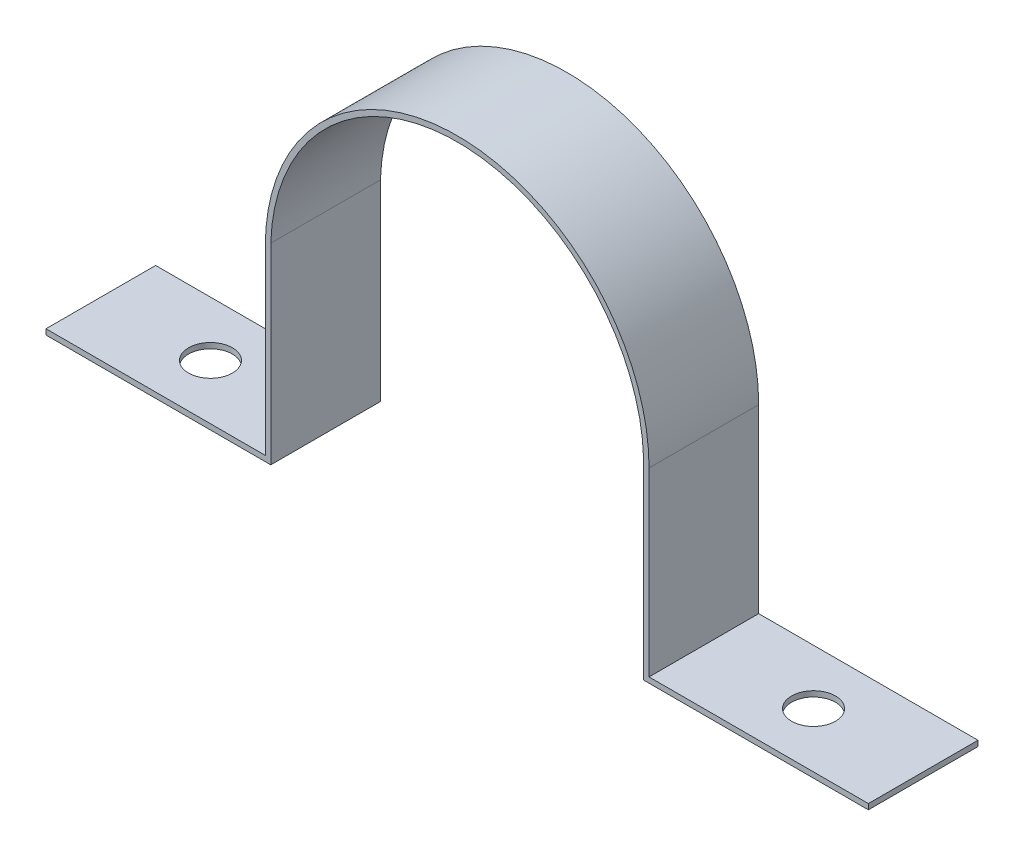
ISO-10303-21;
HEADER;
FILE_DESCRIPTION(('STEP AP214'),'2;1');
FILE_NAME('part.step','',(''),(''),'','','');
FILE_SCHEMA(('AUTOMOTIVE_DESIGN { 1 0 10303 214 1 1 1 1 }'));
ENDSEC;
DATA;
#1=APPLICATION_CONTEXT('core data for automotive mechanical design processes');
#2=APPLICATION_PROTOCOL_DEFINITION('international standard','automotive_design',2000,#1);
#3=PRODUCT_CONTEXT('',#1,'mechanical');
#4=PRODUCT('Part','Part','',(#3));
#5=PRODUCT_RELATED_PRODUCT_CATEGORY('part','',(#4));
#6=PRODUCT_DEFINITION_FORMATION('','',#4);
#7=PRODUCT_DEFINITION_CONTEXT('part definition',#1,'design');
#8=PRODUCT_DEFINITION('design','',#6,#7);
#9=PRODUCT_DEFINITION_SHAPE('','',#8);
#10=(LENGTH_UNIT() NAMED_UNIT(*) SI_UNIT(.MILLI.,.METRE.));
#11=(NAMED_UNIT(*) PLANE_ANGLE_UNIT() SI_UNIT($,.RADIAN.));
#12=(NAMED_UNIT(*) SI_UNIT($,.STERADIAN.) SOLID_ANGLE_UNIT());
#13=UNCERTAINTY_MEASURE_WITH_UNIT(LENGTH_MEASURE(1.E-05),#10,'distance_accuracy_value','');
#14=(GEOMETRIC_REPRESENTATION_CONTEXT(3) GLOBAL_UNCERTAINTY_ASSIGNED_CONTEXT((#13)) GLOBAL_UNIT_ASSIGNED_CONTEXT((#10,
#11,#12)) REPRESENTATION_CONTEXT('',''));
#15=CARTESIAN_POINT('',(0.,0.,0.));
#16=DIRECTION('',(0.,0.,1.));
#17=DIRECTION('',(1.,0.,0.));
#18=AXIS2_PLACEMENT_3D('',#15,#16,#17);
#19=CARTESIAN_POINT('',(0.,0.,10.));
#20=DIRECTION('',(0.,0.,-1.));
#21=DIRECTION('',(-1.,0.,0.));
#22=AXIS2_PLACEMENT_3D('',#19,#20,#21);
#23=CYLINDRICAL_SURFACE('',#22,17.5);
#24=CARTESIAN_POINT('',(0.,0.,0.));
#25=DIRECTION('',(0.,0.,1.));
#26=DIRECTION('',(1.,0.,0.));
#27=AXIS2_PLACEMENT_3D('',#24,#25,#26);
#28=CIRCLE('',#27,17.5);
#29=CARTESIAN_POINT('',(17.5,0.,0.));
#30=VERTEX_POINT('',#29);
#31=CARTESIAN_POINT('',(-17.5,0.,0.));
#32=VERTEX_POINT('',#31);
#33=EDGE_CURVE('E169',#30,#32,#28,.T.);
#34=ORIENTED_EDGE('',*,*,#33,.T.);
#35=DIRECTION('',(0.,0.,-1.));
#36=VECTOR('',#35,1.);
#37=CARTESIAN_POINT('',(-17.5,0.,10.));
#38=LINE('',#37,#36);
#39=CARTESIAN_POINT('',(-17.5,0.,10.));
#40=VERTEX_POINT('',#39);
#41=EDGE_CURVE('E13',#40,#32,#38,.T.);
#42=ORIENTED_EDGE('',*,*,#41,.F.);
#43=CARTESIAN_POINT('',(0.,0.,10.));
#44=DIRECTION('',(0.,0.,1.));
#45=DIRECTION('',(1.,0.,0.));
#46=AXIS2_PLACEMENT_3D('',#43,#44,#45);
#47=CIRCLE('',#46,17.5);
#48=CARTESIAN_POINT('',(17.5,0.,10.));
#49=VERTEX_POINT('',#48);
#50=EDGE_CURVE('E191',#49,#40,#47,.T.);
#51=ORIENTED_EDGE('',*,*,#50,.F.);
#52=DIRECTION('',(0.,0.,-1.));
#53=VECTOR('',#52,1.);
#54=CARTESIAN_POINT('',(17.5,0.,10.));
#55=LINE('',#54,#53);
#56=EDGE_CURVE('E165',#49,#30,#55,.T.);
#57=ORIENTED_EDGE('',*,*,#56,.T.);
#58=EDGE_LOOP('',(#34,#42,#51,#57));
#59=FACE_BOUND('',#58,.T.);
#60=ADVANCED_FACE('F48',(#59),#23,.T.);
#61=CARTESIAN_POINT('',(-17.5,0.,10.));
#62=DIRECTION('',(1.,0.,0.));
#63=DIRECTION('',(0.,0.,-1.));
#64=AXIS2_PLACEMENT_3D('',#61,#62,#63);
#65=PLANE('',#64);
#66=DIRECTION('',(0.,-1.,0.));
#67=VECTOR('',#66,1.);
#68=CARTESIAN_POINT('',(-17.5,0.,0.));
#69=LINE('',#68,#67);
#70=CARTESIAN_POINT('',(-17.5,-16.5073513516949,0.));
#71=VERTEX_POINT('',#70);
#72=EDGE_CURVE('E172',#32,#71,#69,.T.);
#73=ORIENTED_EDGE('',*,*,#72,.T.);
#74=DIRECTION('',(0.,0.,-1.));
#75=VECTOR('',#74,1.);
#76=CARTESIAN_POINT('',(-17.5,-16.5073513516949,10.));
#77=LINE('',#76,#75);
#78=CARTESIAN_POINT('',(-17.5,-16.5073513516949,10.));
#79=VERTEX_POINT('',#78);
#80=EDGE_CURVE('E57',#79,#71,#77,.T.);
#81=ORIENTED_EDGE('',*,*,#80,.F.);
#82=DIRECTION('',(0.,-1.,0.));
#83=VECTOR('',#82,1.);
#84=CARTESIAN_POINT('',(-17.5,0.,10.));
#85=LINE('',#84,#83);
#86=EDGE_CURVE('E120',#40,#79,#85,.T.);
#87=ORIENTED_EDGE('',*,*,#86,.F.);
#88=ORIENTED_EDGE('',*,*,#41,.T.);
#89=EDGE_LOOP('',(#73,#81,#87,#88));
#90=FACE_BOUND('',#89,.T.);
#91=ADVANCED_FACE('F271',(#90),#65,.F.);
#92=CARTESIAN_POINT('',(-37.5,-16.5073513516949,10.));
#93=DIRECTION('',(0.,-1.,0.));
#94=DIRECTION('',(0.,0.,-1.));
#95=AXIS2_PLACEMENT_3D('',#92,#93,#94);
#96=PLANE('',#95);
#97=CARTESIAN_POINT('',(-27.5,-16.5073513516949,5.));
#98=DIRECTION('',(0.,1.,0.));
#99=DIRECTION('',(0.,0.,1.));
#100=AXIS2_PLACEMENT_3D('',#97,#98,#99);
#101=CIRCLE('',#100,2.);
#102=CARTESIAN_POINT('',(-27.5,-16.5073513516949,7.));
#103=VERTEX_POINT('',#102);
#104=EDGE_CURVE('E340',#103,#103,#101,.T.);
#105=ORIENTED_EDGE('',*,*,#104,.F.);
#106=EDGE_LOOP('',(#105));
#107=FACE_BOUND('',#106,.T.);
#108=DIRECTION('',(-1.,0.,0.));
#109=VECTOR('',#108,1.);
#110=CARTESIAN_POINT('',(-37.5,-16.5073513516949,0.));
#111=LINE('',#110,#109);
#112=CARTESIAN_POINT('',(-37.5,-16.5073513516949,0.));
#113=VERTEX_POINT('',#112);
#114=EDGE_CURVE('E174',#71,#113,#111,.T.);
#115=ORIENTED_EDGE('',*,*,#114,.T.);
#116=DIRECTION('',(0.,0.,-1.));
#117=VECTOR('',#116,1.);
#118=CARTESIAN_POINT('',(-37.5,-16.5073513516949,10.));
#119=LINE('',#118,#117);
#120=CARTESIAN_POINT('',(-37.5,-16.5073513516949,10.));
#121=VERTEX_POINT('',#120);
#122=EDGE_CURVE('E210',#121,#113,#119,.T.);
#123=ORIENTED_EDGE('',*,*,#122,.F.);
#124=DIRECTION('',(-1.,0.,0.));
#125=VECTOR('',#124,1.);
#126=CARTESIAN_POINT('',(-37.5,-16.5073513516949,10.));
#127=LINE('',#126,#125);
#128=EDGE_CURVE('E219',#79,#121,#127,.T.);
#129=ORIENTED_EDGE('',*,*,#128,.F.);
#130=ORIENTED_EDGE('',*,*,#80,.T.);
#131=EDGE_LOOP('',(#115,#123,#129,#130));
#132=FACE_BOUND('',#131,.T.);
#133=ADVANCED_FACE('F217',(#107,#132),#96,.F.);
#134=CARTESIAN_POINT('',(-37.5,-17.007351351695,10.));
#135=DIRECTION('',(1.,0.,0.));
#136=DIRECTION('',(0.,0.,-1.));
#137=AXIS2_PLACEMENT_3D('',#134,#135,#136);
#138=PLANE('',#137);
#139=DIRECTION('',(0.,-1.,0.));
#140=VECTOR('',#139,1.);
#141=CARTESIAN_POINT('',(-37.5,-17.007351351695,0.));
#142=LINE('',#141,#140);
#143=CARTESIAN_POINT('',(-37.5,-17.007351351695,0.));
#144=VERTEX_POINT('',#143);
#145=EDGE_CURVE('E176',#113,#144,#142,.T.);
#146=ORIENTED_EDGE('',*,*,#145,.T.);
#147=DIRECTION('',(0.,0.,-1.));
#148=VECTOR('',#147,1.);
#149=CARTESIAN_POINT('',(-37.5,-17.007351351695,10.));
#150=LINE('',#149,#148);
#151=CARTESIAN_POINT('',(-37.5,-17.007351351695,10.));
#152=VERTEX_POINT('',#151);
#153=EDGE_CURVE('E207',#152,#144,#150,.T.);
#154=ORIENTED_EDGE('',*,*,#153,.F.);
#155=DIRECTION('',(0.,-1.,0.));
#156=VECTOR('',#155,1.);
#157=CARTESIAN_POINT('',(-37.5,-17.007351351695,10.));
#158=LINE('',#157,#156);
#159=EDGE_CURVE('E237',#121,#152,#158,.T.);
#160=ORIENTED_EDGE('',*,*,#159,.F.);
#161=ORIENTED_EDGE('',*,*,#122,.T.);
#162=EDGE_LOOP('',(#146,#154,#160,#161));
#163=FACE_BOUND('',#162,.T.);
#164=ADVANCED_FACE('F228',(#163),#138,.F.);
#165=CARTESIAN_POINT('',(-17.,-17.0073513516949,10.));
#166=DIRECTION('',(0.,1.,0.));
#167=DIRECTION('',(-1.,0.,0.));
#168=AXIS2_PLACEMENT_3D('',#165,#166,#167);
#169=PLANE('',#168);
#170=CARTESIAN_POINT('',(-27.5,-17.0073513516949,5.));
#171=DIRECTION('',(0.,1.,0.));
#172=DIRECTION('',(-1.,0.,0.));
#173=AXIS2_PLACEMENT_3D('',#170,#171,#172);
#174=CIRCLE('',#173,2.);
#175=CARTESIAN_POINT('',(-29.5,-17.0073513516949,5.));
#176=VERTEX_POINT('',#175);
#177=EDGE_CURVE('E51',#176,#176,#174,.T.);
#178=ORIENTED_EDGE('',*,*,#177,.T.);
#179=EDGE_LOOP('',(#178));
#180=FACE_BOUND('',#179,.T.);
#181=DIRECTION('',(1.,0.,0.));
#182=VECTOR('',#181,1.);
#183=CARTESIAN_POINT('',(-17.,-17.0073513516949,0.));
#184=LINE('',#183,#182);
#185=CARTESIAN_POINT('',(-17.,-17.0073513516949,0.));
#186=VERTEX_POINT('',#185);
#187=EDGE_CURVE('E178',#144,#186,#184,.T.);
#188=ORIENTED_EDGE('',*,*,#187,.T.);
#189=DIRECTION('',(0.,0.,-1.));
#190=VECTOR('',#189,1.);
#191=CARTESIAN_POINT('',(-17.,-17.0073513516949,10.));
#192=LINE('',#191,#190);
#193=CARTESIAN_POINT('',(-17.,-17.0073513516949,10.));
#194=VERTEX_POINT('',#193);
#195=EDGE_CURVE('E204',#194,#186,#192,.T.);
#196=ORIENTED_EDGE('',*,*,#195,.F.);
#197=DIRECTION('',(1.,0.,0.));
#198=VECTOR('',#197,1.);
#199=CARTESIAN_POINT('',(-17.,-17.0073513516949,10.));
#200=LINE('',#199,#198);
#201=EDGE_CURVE('E234',#152,#194,#200,.T.);
#202=ORIENTED_EDGE('',*,*,#201,.F.);
#203=ORIENTED_EDGE('',*,*,#153,.T.);
#204=EDGE_LOOP('',(#188,#196,#202,#203));
#205=FACE_BOUND('',#204,.T.);
#206=ADVANCED_FACE('F232',(#180,#205),#169,.F.);
#207=CARTESIAN_POINT('',(-17.,0.499999999999925,10.));
#208=DIRECTION('',(-1.,0.,0.));
#209=DIRECTION('',(0.,0.,1.));
#210=AXIS2_PLACEMENT_3D('',#207,#208,#209);
#211=PLANE('',#210);
#212=DIRECTION('',(0.,1.,0.));
#213=VECTOR('',#212,1.);
#214=CARTESIAN_POINT('',(-17.,0.499999999999925,0.));
#215=LINE('',#214,#213);
#216=CARTESIAN_POINT('',(-17.,0.499999999999924,0.));
#217=VERTEX_POINT('',#216);
#218=EDGE_CURVE('E180',#186,#217,#215,.T.);
#219=ORIENTED_EDGE('',*,*,#218,.T.);
#220=DIRECTION('',(0.,0.,-1.));
#221=VECTOR('',#220,1.);
#222=CARTESIAN_POINT('',(-17.,0.499999999999924,10.));
#223=LINE('',#222,#221);
#224=CARTESIAN_POINT('',(-17.,0.499999999999924,10.));
#225=VERTEX_POINT('',#224);
#226=EDGE_CURVE('E201',#225,#217,#223,.T.);
#227=ORIENTED_EDGE('',*,*,#226,.F.);
#228=DIRECTION('',(0.,1.,0.));
#229=VECTOR('',#228,1.);
#230=CARTESIAN_POINT('',(-17.,0.499999999999925,10.));
#231=LINE('',#230,#229);
#232=EDGE_CURVE('E236',#194,#225,#231,.T.);
#233=ORIENTED_EDGE('',*,*,#232,.F.);
#234=ORIENTED_EDGE('',*,*,#195,.T.);
#235=EDGE_LOOP('',(#219,#227,#233,#234));
#236=FACE_BOUND('',#235,.T.);
#237=ADVANCED_FACE('F285',(#236),#211,.F.);
#238=CARTESIAN_POINT('',(0.,0.,10.));
#239=DIRECTION('',(0.,0.,-1.));
#240=DIRECTION('',(-1.,0.,0.));
#241=AXIS2_PLACEMENT_3D('',#238,#239,#240);
#242=CYLINDRICAL_SURFACE('',#241,17.0073513516949);
#243=CARTESIAN_POINT('',(0.,0.,0.));
#244=DIRECTION('',(0.,0.,-1.));
#245=DIRECTION('',(1.,0.,0.));
#246=AXIS2_PLACEMENT_3D('',#243,#244,#245);
#247=CIRCLE('',#246,17.0073513516949);
#248=CARTESIAN_POINT('',(17.,0.499999999999925,0.));
#249=VERTEX_POINT('',#248);
#250=EDGE_CURVE('E182',#217,#249,#247,.T.);
#251=ORIENTED_EDGE('',*,*,#250,.T.);
#252=DIRECTION('',(0.,0.,-1.));
#253=VECTOR('',#252,1.);
#254=CARTESIAN_POINT('',(17.,0.499999999999925,10.));
#255=LINE('',#254,#253);
#256=CARTESIAN_POINT('',(17.,0.499999999999925,10.));
#257=VERTEX_POINT('',#256);
#258=EDGE_CURVE('E198',#257,#249,#255,.T.);
#259=ORIENTED_EDGE('',*,*,#258,.F.);
#260=CARTESIAN_POINT('',(0.,0.,10.));
#261=DIRECTION('',(0.,0.,-1.));
#262=DIRECTION('',(1.,0.,0.));
#263=AXIS2_PLACEMENT_3D('',#260,#261,#262);
#264=CIRCLE('',#263,17.0073513516949);
#265=EDGE_CURVE('E239',#225,#257,#264,.T.);
#266=ORIENTED_EDGE('',*,*,#265,.F.);
#267=ORIENTED_EDGE('',*,*,#226,.T.);
#268=EDGE_LOOP('',(#251,#259,#266,#267));
#269=FACE_BOUND('',#268,.T.);
#270=ADVANCED_FACE('F289',(#269),#242,.F.);
#271=CARTESIAN_POINT('',(17.,0.499999999999925,10.));
#272=DIRECTION('',(1.,0.,0.));
#273=DIRECTION('',(0.,0.,-1.));
#274=AXIS2_PLACEMENT_3D('',#271,#272,#273);
#275=PLANE('',#274);
#276=DIRECTION('',(0.,-1.,0.));
#277=VECTOR('',#276,1.);
#278=CARTESIAN_POINT('',(17.,0.499999999999925,0.));
#279=LINE('',#278,#277);
#280=CARTESIAN_POINT('',(17.,-17.0073513516949,0.));
#281=VERTEX_POINT('',#280);
#282=EDGE_CURVE('E184',#249,#281,#279,.T.);
#283=ORIENTED_EDGE('',*,*,#282,.T.);
#284=DIRECTION('',(0.,0.,-1.));
#285=VECTOR('',#284,1.);
#286=CARTESIAN_POINT('',(17.,-17.0073513516949,10.));
#287=LINE('',#286,#285);
#288=CARTESIAN_POINT('',(17.,-17.0073513516949,10.));
#289=VERTEX_POINT('',#288);
#290=EDGE_CURVE('E195',#289,#281,#287,.T.);
#291=ORIENTED_EDGE('',*,*,#290,.F.);
#292=DIRECTION('',(0.,-1.,0.));
#293=VECTOR('',#292,1.);
#294=CARTESIAN_POINT('',(17.,0.499999999999925,10.));
#295=LINE('',#294,#293);
#296=EDGE_CURVE('E245',#257,#289,#295,.T.);
#297=ORIENTED_EDGE('',*,*,#296,.F.);
#298=ORIENTED_EDGE('',*,*,#258,.T.);
#299=EDGE_LOOP('',(#283,#291,#297,#298));
#300=FACE_BOUND('',#299,.T.);
#301=ADVANCED_FACE('F251',(#300),#275,.F.);
#302=CARTESIAN_POINT('',(17.,-17.0073513516949,10.));
#303=DIRECTION('',(0.,1.,0.));
#304=DIRECTION('',(-1.,0.,0.));
#305=AXIS2_PLACEMENT_3D('',#302,#303,#304);
#306=PLANE('',#305);
#307=CARTESIAN_POINT('',(27.5,-17.0073513516949,5.));
#308=DIRECTION('',(0.,1.,0.));
#309=DIRECTION('',(-1.,0.,0.));
#310=AXIS2_PLACEMENT_3D('',#307,#308,#309);
#311=CIRCLE('',#310,2.);
#312=CARTESIAN_POINT('',(25.5,-17.0073513516949,5.));
#313=VERTEX_POINT('',#312);
#314=EDGE_CURVE('E343',#313,#313,#311,.T.);
#315=ORIENTED_EDGE('',*,*,#314,.T.);
#316=EDGE_LOOP('',(#315));
#317=FACE_BOUND('',#316,.T.);
#318=DIRECTION('',(1.,0.,0.));
#319=VECTOR('',#318,1.);
#320=CARTESIAN_POINT('',(17.,-17.0073513516949,0.));
#321=LINE('',#320,#319);
#322=CARTESIAN_POINT('',(37.5,-17.0073513516949,0.));
#323=VERTEX_POINT('',#322);
#324=EDGE_CURVE('E186',#281,#323,#321,.T.);
#325=ORIENTED_EDGE('',*,*,#324,.T.);
#326=DIRECTION('',(0.,0.,-1.));
#327=VECTOR('',#326,1.);
#328=CARTESIAN_POINT('',(37.5,-17.0073513516949,10.));
#329=LINE('',#328,#327);
#330=CARTESIAN_POINT('',(37.5,-17.0073513516949,10.));
#331=VERTEX_POINT('',#330);
#332=EDGE_CURVE('E160',#331,#323,#329,.T.);
#333=ORIENTED_EDGE('',*,*,#332,.F.);
#334=DIRECTION('',(1.,0.,0.));
#335=VECTOR('',#334,1.);
#336=CARTESIAN_POINT('',(17.,-17.0073513516949,10.));
#337=LINE('',#336,#335);
#338=EDGE_CURVE('E151',#289,#331,#337,.T.);
#339=ORIENTED_EDGE('',*,*,#338,.F.);
#340=ORIENTED_EDGE('',*,*,#290,.T.);
#341=EDGE_LOOP('',(#325,#333,#339,#340));
#342=FACE_BOUND('',#341,.T.);
#343=ADVANCED_FACE('F255',(#317,#342),#306,.F.);
#344=CARTESIAN_POINT('',(37.5,-17.0073513516949,10.));
#345=DIRECTION('',(-1.,0.,0.));
#346=DIRECTION('',(0.,0.,1.));
#347=AXIS2_PLACEMENT_3D('',#344,#345,#346);
#348=PLANE('',#347);
#349=DIRECTION('',(0.,1.,0.));
#350=VECTOR('',#349,1.);
#351=CARTESIAN_POINT('',(37.5,-17.0073513516949,0.));
#352=LINE('',#351,#350);
#353=CARTESIAN_POINT('',(37.5,-16.5073513516949,0.));
#354=VERTEX_POINT('',#353);
#355=EDGE_CURVE('E159',#323,#354,#352,.T.);
#356=ORIENTED_EDGE('',*,*,#355,.T.);
#357=DIRECTION('',(0.,0.,-1.));
#358=VECTOR('',#357,1.);
#359=CARTESIAN_POINT('',(37.5,-16.5073513516949,10.));
#360=LINE('',#359,#358);
#361=CARTESIAN_POINT('',(37.5,-16.5073513516949,10.));
#362=VERTEX_POINT('',#361);
#363=EDGE_CURVE('E156',#362,#354,#360,.T.);
#364=ORIENTED_EDGE('',*,*,#363,.F.);
#365=DIRECTION('',(0.,1.,0.));
#366=VECTOR('',#365,1.);
#367=CARTESIAN_POINT('',(37.5,-17.0073513516949,10.));
#368=LINE('',#367,#366);
#369=EDGE_CURVE('E145',#331,#362,#368,.T.);
#370=ORIENTED_EDGE('',*,*,#369,.F.);
#371=ORIENTED_EDGE('',*,*,#332,.T.);
#372=EDGE_LOOP('',(#356,#364,#370,#371));
#373=FACE_BOUND('',#372,.T.);
#374=ADVANCED_FACE('F157',(#373),#348,.F.);
#375=CARTESIAN_POINT('',(37.5,-16.5073513516949,10.));
#376=DIRECTION('',(0.,-1.,0.));
#377=DIRECTION('',(1.,0.,0.));
#378=AXIS2_PLACEMENT_3D('',#375,#376,#377);
#379=PLANE('',#378);
#380=CARTESIAN_POINT('',(27.5,-16.5073513516949,5.));
#381=DIRECTION('',(0.,1.,0.));
#382=DIRECTION('',(0.,0.,1.));
#383=AXIS2_PLACEMENT_3D('',#380,#381,#382);
#384=CIRCLE('',#383,2.);
#385=CARTESIAN_POINT('',(27.5,-16.5073513516949,7.));
#386=VERTEX_POINT('',#385);
#387=EDGE_CURVE('E347',#386,#386,#384,.T.);
#388=ORIENTED_EDGE('',*,*,#387,.F.);
#389=EDGE_LOOP('',(#388));
#390=FACE_BOUND('',#389,.T.);
#391=DIRECTION('',(-1.,0.,0.));
#392=VECTOR('',#391,1.);
#393=CARTESIAN_POINT('',(37.5,-16.5073513516949,0.));
#394=LINE('',#393,#392);
#395=CARTESIAN_POINT('',(17.5,-16.5073513516949,0.));
#396=VERTEX_POINT('',#395);
#397=EDGE_CURVE('E106',#354,#396,#394,.T.);
#398=ORIENTED_EDGE('',*,*,#397,.T.);
#399=DIRECTION('',(0.,0.,-1.));
#400=VECTOR('',#399,1.);
#401=CARTESIAN_POINT('',(17.5,-16.5073513516949,10.));
#402=LINE('',#401,#400);
#403=CARTESIAN_POINT('',(17.5,-16.5073513516949,10.));
#404=VERTEX_POINT('',#403);
#405=EDGE_CURVE('E161',#404,#396,#402,.T.);
#406=ORIENTED_EDGE('',*,*,#405,.F.);
#407=DIRECTION('',(-1.,0.,0.));
#408=VECTOR('',#407,1.);
#409=CARTESIAN_POINT('',(37.5,-16.5073513516949,10.));
#410=LINE('',#409,#408);
#411=EDGE_CURVE('E149',#362,#404,#410,.T.);
#412=ORIENTED_EDGE('',*,*,#411,.F.);
#413=ORIENTED_EDGE('',*,*,#363,.T.);
#414=EDGE_LOOP('',(#398,#406,#412,#413));
#415=FACE_BOUND('',#414,.T.);
#416=ADVANCED_FACE('F163',(#390,#415),#379,.F.);
#417=CARTESIAN_POINT('',(17.5,0.,10.));
#418=DIRECTION('',(-1.,0.,0.));
#419=DIRECTION('',(0.,0.,1.));
#420=AXIS2_PLACEMENT_3D('',#417,#418,#419);
#421=PLANE('',#420);
#422=DIRECTION('',(0.,1.,0.));
#423=VECTOR('',#422,1.);
#424=CARTESIAN_POINT('',(17.5,0.,0.));
#425=LINE('',#424,#423);
#426=EDGE_CURVE('E112',#396,#30,#425,.T.);
#427=ORIENTED_EDGE('',*,*,#426,.T.);
#428=ORIENTED_EDGE('',*,*,#56,.F.);
#429=DIRECTION('',(0.,1.,0.));
#430=VECTOR('',#429,1.);
#431=CARTESIAN_POINT('',(17.5,0.,10.));
#432=LINE('',#431,#430);
#433=EDGE_CURVE('E65',#404,#49,#432,.T.);
#434=ORIENTED_EDGE('',*,*,#433,.F.);
#435=ORIENTED_EDGE('',*,*,#405,.T.);
#436=EDGE_LOOP('',(#427,#428,#434,#435));
#437=FACE_BOUND('',#436,.T.);
#438=ADVANCED_FACE('F259',(#437),#421,.F.);
#439=CARTESIAN_POINT('',(0.,0.,10.));
#440=DIRECTION('',(0.,0.,1.));
#441=DIRECTION('',(1.,0.,0.));
#442=AXIS2_PLACEMENT_3D('',#439,#440,#441);
#443=PLANE('',#442);
#444=ORIENTED_EDGE('',*,*,#50,.T.);
#445=ORIENTED_EDGE('',*,*,#86,.T.);
#446=ORIENTED_EDGE('',*,*,#128,.T.);
#447=ORIENTED_EDGE('',*,*,#159,.T.);
#448=ORIENTED_EDGE('',*,*,#201,.T.);
#449=ORIENTED_EDGE('',*,*,#232,.T.);
#450=ORIENTED_EDGE('',*,*,#265,.T.);
#451=ORIENTED_EDGE('',*,*,#296,.T.);
#452=ORIENTED_EDGE('',*,*,#338,.T.);
#453=ORIENTED_EDGE('',*,*,#369,.T.);
#454=ORIENTED_EDGE('',*,*,#411,.T.);
#455=ORIENTED_EDGE('',*,*,#433,.T.);
#456=EDGE_LOOP('',(#444,#445,#446,#447,#448,#449,#450,#451,#452,#453,#454,#455));
#457=FACE_BOUND('',#456,.T.);
#458=ADVANCED_FACE('F147',(#457),#443,.T.);
#459=CARTESIAN_POINT('',(0.,0.,0.));
#460=DIRECTION('',(0.,0.,1.));
#461=DIRECTION('',(1.,0.,0.));
#462=AXIS2_PLACEMENT_3D('',#459,#460,#461);
#463=PLANE('',#462);
#464=ORIENTED_EDGE('',*,*,#33,.F.);
#465=ORIENTED_EDGE('',*,*,#426,.F.);
#466=ORIENTED_EDGE('',*,*,#397,.F.);
#467=ORIENTED_EDGE('',*,*,#355,.F.);
#468=ORIENTED_EDGE('',*,*,#324,.F.);
#469=ORIENTED_EDGE('',*,*,#282,.F.);
#470=ORIENTED_EDGE('',*,*,#250,.F.);
#471=ORIENTED_EDGE('',*,*,#218,.F.);
#472=ORIENTED_EDGE('',*,*,#187,.F.);
#473=ORIENTED_EDGE('',*,*,#145,.F.);
#474=ORIENTED_EDGE('',*,*,#114,.F.);
#475=ORIENTED_EDGE('',*,*,#72,.F.);
#476=EDGE_LOOP('',(#464,#465,#466,#467,#468,#469,#470,#471,#472,#473,#474,#475));
#477=FACE_BOUND('',#476,.T.);
#478=ADVANCED_FACE('F223',(#477),#463,.F.);
#479=CARTESIAN_POINT('',(27.5,-26.507351351695,5.));
#480=DIRECTION('',(0.,1.,0.));
#481=DIRECTION('',(0.,0.,1.));
#482=AXIS2_PLACEMENT_3D('',#479,#480,#481);
#483=CYLINDRICAL_SURFACE('',#482,2.);
#484=ORIENTED_EDGE('',*,*,#387,.T.);
#485=EDGE_LOOP('',(#484));
#486=FACE_BOUND('',#485,.T.);
#487=ORIENTED_EDGE('',*,*,#314,.F.);
#488=EDGE_LOOP('',(#487));
#489=FACE_BOUND('',#488,.T.);
#490=ADVANCED_FACE('F321',(#486,#489),#483,.F.);
#491=CARTESIAN_POINT('',(-27.5,-26.507351351695,5.));
#492=DIRECTION('',(0.,1.,0.));
#493=DIRECTION('',(0.,0.,1.));
#494=AXIS2_PLACEMENT_3D('',#491,#492,#493);
#495=CYLINDRICAL_SURFACE('',#494,2.);
#496=ORIENTED_EDGE('',*,*,#104,.T.);
#497=EDGE_LOOP('',(#496));
#498=FACE_BOUND('',#497,.T.);
#499=ORIENTED_EDGE('',*,*,#177,.F.);
#500=EDGE_LOOP('',(#499));
#501=FACE_BOUND('',#500,.T.);
#502=ADVANCED_FACE('F327',(#498,#501),#495,.F.);
#503=CLOSED_SHELL('',(#60,#91,#133,#164,#206,#237,#270,#301,#343,#374,#416,#438,#458,#478,#490,#502));
#504=MANIFOLD_SOLID_BREP('B2',#503);
#505=ADVANCED_BREP_SHAPE_REPRESENTATION('',(#18,#504),#14);
#506=SHAPE_DEFINITION_REPRESENTATION(#9,#505);
ENDSEC;
END-ISO-10303-21;
